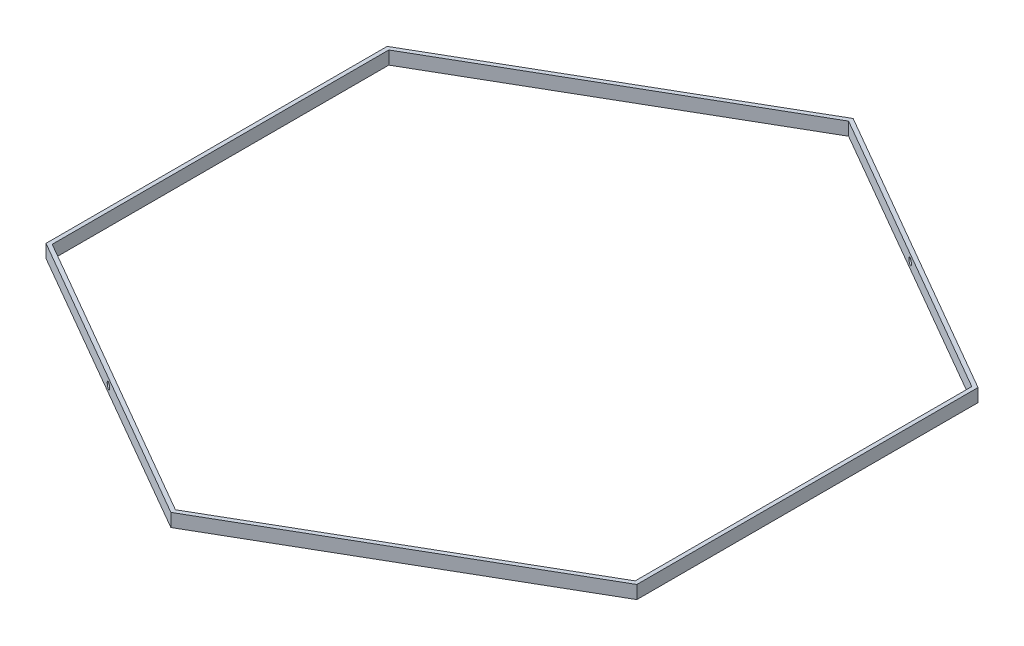
ISO-10303-21;
HEADER;
FILE_DESCRIPTION(('STEP AP214'),'2;1');
FILE_NAME('part.step','',(''),(''),'','','');
FILE_SCHEMA(('AUTOMOTIVE_DESIGN { 1 0 10303 214 1 1 1 1 }'));
ENDSEC;
DATA;
#1=APPLICATION_CONTEXT('core data for automotive mechanical design processes');
#2=APPLICATION_PROTOCOL_DEFINITION('international standard','automotive_design',2000,#1);
#3=PRODUCT_CONTEXT('',#1,'mechanical');
#4=PRODUCT('Part','Part','',(#3));
#5=PRODUCT_RELATED_PRODUCT_CATEGORY('part','',(#4));
#6=PRODUCT_DEFINITION_FORMATION('','',#4);
#7=PRODUCT_DEFINITION_CONTEXT('part definition',#1,'design');
#8=PRODUCT_DEFINITION('design','',#6,#7);
#9=PRODUCT_DEFINITION_SHAPE('','',#8);
#10=(LENGTH_UNIT() NAMED_UNIT(*) SI_UNIT(.MILLI.,.METRE.));
#11=(NAMED_UNIT(*) PLANE_ANGLE_UNIT() SI_UNIT($,.RADIAN.));
#12=(NAMED_UNIT(*) SI_UNIT($,.STERADIAN.) SOLID_ANGLE_UNIT());
#13=UNCERTAINTY_MEASURE_WITH_UNIT(LENGTH_MEASURE(1.E-05),#10,'distance_accuracy_value','');
#14=(GEOMETRIC_REPRESENTATION_CONTEXT(3) GLOBAL_UNCERTAINTY_ASSIGNED_CONTEXT((#13)) GLOBAL_UNIT_ASSIGNED_CONTEXT((#10,
#11,#12)) REPRESENTATION_CONTEXT('',''));
#15=CARTESIAN_POINT('',(0.,0.,0.));
#16=DIRECTION('',(0.,0.,1.));
#17=DIRECTION('',(1.,0.,0.));
#18=AXIS2_PLACEMENT_3D('',#15,#16,#17);
#19=CARTESIAN_POINT('',(0.,4.,0.));
#20=DIRECTION('',(0.,1.,0.));
#21=DIRECTION('',(0.,0.,1.));
#22=AXIS2_PLACEMENT_3D('',#19,#20,#21);
#23=PLANE('',#22);
#24=DIRECTION('',(-0.866025403784439,0.,-0.5));
#25=VECTOR('',#24,1.);
#26=CARTESIAN_POINT('',(90.,4.,-51.9615242270663));
#27=LINE('',#26,#25);
#28=CARTESIAN_POINT('',(90.,4.,-51.9615242270663));
#29=VERTEX_POINT('',#28);
#30=CARTESIAN_POINT('',(0.,4.,-103.923048454133));
#31=VERTEX_POINT('',#30);
#32=EDGE_CURVE('E180',#29,#31,#27,.T.);
#33=ORIENTED_EDGE('',*,*,#32,.T.);
#34=DIRECTION('',(-0.866025403784438,0.,0.5));
#35=VECTOR('',#34,1.);
#36=CARTESIAN_POINT('',(0.,4.,-103.923048454133));
#37=LINE('',#36,#35);
#38=CARTESIAN_POINT('',(-90.,4.,-51.9615242270663));
#39=VERTEX_POINT('',#38);
#40=EDGE_CURVE('E183',#31,#39,#37,.T.);
#41=ORIENTED_EDGE('',*,*,#40,.T.);
#42=DIRECTION('',(0.,0.,1.));
#43=VECTOR('',#42,1.);
#44=CARTESIAN_POINT('',(-90.,4.,-51.9615242270663));
#45=LINE('',#44,#43);
#46=CARTESIAN_POINT('',(-90.,4.,51.9615242270663));
#47=VERTEX_POINT('',#46);
#48=EDGE_CURVE('E186',#39,#47,#45,.T.);
#49=ORIENTED_EDGE('',*,*,#48,.T.);
#50=DIRECTION('',(0.866025403784439,0.,0.5));
#51=VECTOR('',#50,1.);
#52=CARTESIAN_POINT('',(-90.,4.,51.9615242270663));
#53=LINE('',#52,#51);
#54=CARTESIAN_POINT('',(0.,4.,103.923048454133));
#55=VERTEX_POINT('',#54);
#56=EDGE_CURVE('E188',#47,#55,#53,.T.);
#57=ORIENTED_EDGE('',*,*,#56,.T.);
#58=DIRECTION('',(0.866025403784438,0.,-0.5));
#59=VECTOR('',#58,1.);
#60=CARTESIAN_POINT('',(0.,4.,103.923048454133));
#61=LINE('',#60,#59);
#62=CARTESIAN_POINT('',(90.,4.,51.9615242270663));
#63=VERTEX_POINT('',#62);
#64=EDGE_CURVE('E190',#55,#63,#61,.T.);
#65=ORIENTED_EDGE('',*,*,#64,.T.);
#66=DIRECTION('',(0.,0.,-1.));
#67=VECTOR('',#66,1.);
#68=CARTESIAN_POINT('',(90.,4.,51.9615242270663));
#69=LINE('',#68,#67);
#70=EDGE_CURVE('E192',#63,#29,#69,.T.);
#71=ORIENTED_EDGE('',*,*,#70,.T.);
#72=EDGE_LOOP('',(#33,#41,#49,#57,#65,#71));
#73=FACE_BOUND('',#72,.T.);
#74=DIRECTION('',(-0.866025403784439,0.,-0.5));
#75=VECTOR('',#74,1.);
#76=CARTESIAN_POINT('',(88.8,4.,-51.2687039040388));
#77=LINE('',#76,#75);
#78=CARTESIAN_POINT('',(88.8,4.,-51.2687039040388));
#79=VERTEX_POINT('',#78);
#80=CARTESIAN_POINT('',(0.,4.,-102.537407808078));
#81=VERTEX_POINT('',#80);
#82=EDGE_CURVE('E135',#79,#81,#77,.T.);
#83=ORIENTED_EDGE('',*,*,#82,.F.);
#84=DIRECTION('',(0.,0.,-1.));
#85=VECTOR('',#84,1.);
#86=CARTESIAN_POINT('',(88.8,4.,51.2687039040388));
#87=LINE('',#86,#85);
#88=CARTESIAN_POINT('',(88.8,4.,51.2687039040388));
#89=VERTEX_POINT('',#88);
#90=EDGE_CURVE('E127',#89,#79,#87,.T.);
#91=ORIENTED_EDGE('',*,*,#90,.F.);
#92=DIRECTION('',(0.866025403784438,0.,-0.5));
#93=VECTOR('',#92,1.);
#94=CARTESIAN_POINT('',(0.,4.,102.537407808078));
#95=LINE('',#94,#93);
#96=CARTESIAN_POINT('',(0.,4.,102.537407808078));
#97=VERTEX_POINT('',#96);
#98=EDGE_CURVE('E157',#97,#89,#95,.T.);
#99=ORIENTED_EDGE('',*,*,#98,.F.);
#100=DIRECTION('',(0.866025403784439,0.,0.5));
#101=VECTOR('',#100,1.);
#102=CARTESIAN_POINT('',(-88.8,4.,51.2687039040388));
#103=LINE('',#102,#101);
#104=CARTESIAN_POINT('',(-88.8,4.,51.2687039040388));
#105=VERTEX_POINT('',#104);
#106=EDGE_CURVE('E155',#105,#97,#103,.T.);
#107=ORIENTED_EDGE('',*,*,#106,.F.);
#108=DIRECTION('',(0.,0.,1.));
#109=VECTOR('',#108,1.);
#110=CARTESIAN_POINT('',(-88.8,4.,-51.2687039040388));
#111=LINE('',#110,#109);
#112=CARTESIAN_POINT('',(-88.8,4.,-51.2687039040388));
#113=VERTEX_POINT('',#112);
#114=EDGE_CURVE('E150',#113,#105,#111,.T.);
#115=ORIENTED_EDGE('',*,*,#114,.F.);
#116=DIRECTION('',(-0.866025403784439,0.,0.5));
#117=VECTOR('',#116,1.);
#118=CARTESIAN_POINT('',(0.,4.,-102.537407808078));
#119=LINE('',#118,#117);
#120=EDGE_CURVE('E148',#81,#113,#119,.T.);
#121=ORIENTED_EDGE('',*,*,#120,.F.);
#122=EDGE_LOOP('',(#83,#91,#99,#107,#115,#121));
#123=FACE_BOUND('',#122,.T.);
#124=ADVANCED_FACE('F37',(#73,#123),#23,.T.);
#125=CARTESIAN_POINT('',(0.,0.,0.));
#126=DIRECTION('',(0.,1.,0.));
#127=DIRECTION('',(0.,0.,1.));
#128=AXIS2_PLACEMENT_3D('',#125,#126,#127);
#129=PLANE('',#128);
#130=DIRECTION('',(-0.866025403784439,0.,-0.5));
#131=VECTOR('',#130,1.);
#132=CARTESIAN_POINT('',(90.,0.,-51.9615242270663));
#133=LINE('',#132,#131);
#134=CARTESIAN_POINT('',(90.,0.,-51.9615242270663));
#135=VERTEX_POINT('',#134);
#136=CARTESIAN_POINT('',(0.,0.,-103.923048454133));
#137=VERTEX_POINT('',#136);
#138=EDGE_CURVE('E143',#135,#137,#133,.T.);
#139=ORIENTED_EDGE('',*,*,#138,.F.);
#140=DIRECTION('',(0.,0.,-1.));
#141=VECTOR('',#140,1.);
#142=CARTESIAN_POINT('',(90.,0.,51.9615242270663));
#143=LINE('',#142,#141);
#144=CARTESIAN_POINT('',(90.,0.,51.9615242270663));
#145=VERTEX_POINT('',#144);
#146=EDGE_CURVE('E184',#145,#135,#143,.T.);
#147=ORIENTED_EDGE('',*,*,#146,.F.);
#148=DIRECTION('',(0.866025403784438,0.,-0.5));
#149=VECTOR('',#148,1.);
#150=CARTESIAN_POINT('',(0.,0.,103.923048454133));
#151=LINE('',#150,#149);
#152=CARTESIAN_POINT('',(0.,0.,103.923048454133));
#153=VERTEX_POINT('',#152);
#154=EDGE_CURVE('E203',#153,#145,#151,.T.);
#155=ORIENTED_EDGE('',*,*,#154,.F.);
#156=DIRECTION('',(0.866025403784439,0.,0.5));
#157=VECTOR('',#156,1.);
#158=CARTESIAN_POINT('',(-90.,0.,51.9615242270663));
#159=LINE('',#158,#157);
#160=CARTESIAN_POINT('',(-90.,0.,51.9615242270663));
#161=VERTEX_POINT('',#160);
#162=EDGE_CURVE('E201',#161,#153,#159,.T.);
#163=ORIENTED_EDGE('',*,*,#162,.F.);
#164=DIRECTION('',(0.,0.,1.));
#165=VECTOR('',#164,1.);
#166=CARTESIAN_POINT('',(-90.,0.,-51.9615242270663));
#167=LINE('',#166,#165);
#168=CARTESIAN_POINT('',(-90.,0.,-51.9615242270663));
#169=VERTEX_POINT('',#168);
#170=EDGE_CURVE('E199',#169,#161,#167,.T.);
#171=ORIENTED_EDGE('',*,*,#170,.F.);
#172=DIRECTION('',(-0.866025403784438,0.,0.5));
#173=VECTOR('',#172,1.);
#174=CARTESIAN_POINT('',(0.,0.,-103.923048454133));
#175=LINE('',#174,#173);
#176=EDGE_CURVE('E197',#137,#169,#175,.T.);
#177=ORIENTED_EDGE('',*,*,#176,.F.);
#178=EDGE_LOOP('',(#139,#147,#155,#163,#171,#177));
#179=FACE_BOUND('',#178,.T.);
#180=DIRECTION('',(0.,0.,-1.));
#181=VECTOR('',#180,1.);
#182=CARTESIAN_POINT('',(88.8,0.,51.2687039040388));
#183=LINE('',#182,#181);
#184=CARTESIAN_POINT('',(88.8,0.,51.2687039040388));
#185=VERTEX_POINT('',#184);
#186=CARTESIAN_POINT('',(88.8,0.,-51.2687039040388));
#187=VERTEX_POINT('',#186);
#188=EDGE_CURVE('E61',#185,#187,#183,.T.);
#189=ORIENTED_EDGE('',*,*,#188,.T.);
#190=DIRECTION('',(-0.866025403784439,0.,-0.5));
#191=VECTOR('',#190,1.);
#192=CARTESIAN_POINT('',(88.8,0.,-51.2687039040388));
#193=LINE('',#192,#191);
#194=CARTESIAN_POINT('',(0.,0.,-102.537407808078));
#195=VERTEX_POINT('',#194);
#196=EDGE_CURVE('E142',#187,#195,#193,.T.);
#197=ORIENTED_EDGE('',*,*,#196,.T.);
#198=DIRECTION('',(-0.866025403784439,0.,0.5));
#199=VECTOR('',#198,1.);
#200=CARTESIAN_POINT('',(0.,0.,-102.537407808078));
#201=LINE('',#200,#199);
#202=CARTESIAN_POINT('',(-88.8,0.,-51.2687039040388));
#203=VERTEX_POINT('',#202);
#204=EDGE_CURVE('E162',#195,#203,#201,.T.);
#205=ORIENTED_EDGE('',*,*,#204,.T.);
#206=DIRECTION('',(0.,0.,1.));
#207=VECTOR('',#206,1.);
#208=CARTESIAN_POINT('',(-88.8,0.,-51.2687039040388));
#209=LINE('',#208,#207);
#210=CARTESIAN_POINT('',(-88.8,0.,51.2687039040388));
#211=VERTEX_POINT('',#210);
#212=EDGE_CURVE('E165',#203,#211,#209,.T.);
#213=ORIENTED_EDGE('',*,*,#212,.T.);
#214=DIRECTION('',(0.866025403784439,0.,0.5));
#215=VECTOR('',#214,1.);
#216=CARTESIAN_POINT('',(-88.8,0.,51.2687039040388));
#217=LINE('',#216,#215);
#218=CARTESIAN_POINT('',(0.,0.,102.537407808078));
#219=VERTEX_POINT('',#218);
#220=EDGE_CURVE('E168',#211,#219,#217,.T.);
#221=ORIENTED_EDGE('',*,*,#220,.T.);
#222=DIRECTION('',(0.866025403784438,0.,-0.5));
#223=VECTOR('',#222,1.);
#224=CARTESIAN_POINT('',(0.,0.,102.537407808078));
#225=LINE('',#224,#223);
#226=EDGE_CURVE('E136',#219,#185,#225,.T.);
#227=ORIENTED_EDGE('',*,*,#226,.T.);
#228=EDGE_LOOP('',(#189,#197,#205,#213,#221,#227));
#229=FACE_BOUND('',#228,.T.);
#230=ADVANCED_FACE('F228',(#179,#229),#129,.F.);
#231=CARTESIAN_POINT('',(90.,4.,-51.9615242270663));
#232=DIRECTION('',(-0.5,0.,0.866025403784438));
#233=DIRECTION('',(0.866025403784439,0.,0.5));
#234=AXIS2_PLACEMENT_3D('',#231,#232,#233);
#235=PLANE('',#234);
#236=CARTESIAN_POINT('',(45.,2.,-77.9422863405995));
#237=DIRECTION('',(-0.5,0.,0.866025403784438));
#238=DIRECTION('',(0.866025403784439,0.,0.5));
#239=AXIS2_PLACEMENT_3D('',#236,#237,#238);
#240=CIRCLE('',#239,0.999999999999999);
#241=CARTESIAN_POINT('',(45.8660254037845,2.,-77.4422863405995));
#242=VERTEX_POINT('',#241);
#243=EDGE_CURVE('E160',#242,#242,#240,.T.);
#244=ORIENTED_EDGE('',*,*,#243,.T.);
#245=EDGE_LOOP('',(#244));
#246=FACE_BOUND('',#245,.T.);
#247=ORIENTED_EDGE('',*,*,#138,.T.);
#248=DIRECTION('',(0.,-1.,0.));
#249=VECTOR('',#248,1.);
#250=CARTESIAN_POINT('',(0.,4.,-103.923048454133));
#251=LINE('',#250,#249);
#252=EDGE_CURVE('E11',#31,#137,#251,.T.);
#253=ORIENTED_EDGE('',*,*,#252,.F.);
#254=ORIENTED_EDGE('',*,*,#32,.F.);
#255=DIRECTION('',(0.,-1.,0.));
#256=VECTOR('',#255,1.);
#257=CARTESIAN_POINT('',(90.,4.,-51.9615242270663));
#258=LINE('',#257,#256);
#259=EDGE_CURVE('E194',#29,#135,#258,.T.);
#260=ORIENTED_EDGE('',*,*,#259,.T.);
#261=EDGE_LOOP('',(#247,#253,#254,#260));
#262=FACE_BOUND('',#261,.T.);
#263=ADVANCED_FACE('F39',(#246,#262),#235,.F.);
#264=CARTESIAN_POINT('',(0.,4.,-103.923048454133));
#265=DIRECTION('',(0.5,0.,0.866025403784438));
#266=DIRECTION('',(0.866025403784439,0.,-0.5));
#267=AXIS2_PLACEMENT_3D('',#264,#265,#266);
#268=PLANE('',#267);
#269=ORIENTED_EDGE('',*,*,#176,.T.);
#270=DIRECTION('',(0.,-1.,0.));
#271=VECTOR('',#270,1.);
#272=CARTESIAN_POINT('',(-90.,4.,-51.9615242270663));
#273=LINE('',#272,#271);
#274=EDGE_CURVE('E46',#39,#169,#273,.T.);
#275=ORIENTED_EDGE('',*,*,#274,.F.);
#276=ORIENTED_EDGE('',*,*,#40,.F.);
#277=ORIENTED_EDGE('',*,*,#252,.T.);
#278=EDGE_LOOP('',(#269,#275,#276,#277));
#279=FACE_BOUND('',#278,.T.);
#280=ADVANCED_FACE('F245',(#279),#268,.F.);
#281=CARTESIAN_POINT('',(-90.,4.,-51.9615242270663));
#282=DIRECTION('',(1.,0.,0.));
#283=DIRECTION('',(0.,0.,-1.));
#284=AXIS2_PLACEMENT_3D('',#281,#282,#283);
#285=PLANE('',#284);
#286=ORIENTED_EDGE('',*,*,#170,.T.);
#287=DIRECTION('',(0.,-1.,0.));
#288=VECTOR('',#287,1.);
#289=CARTESIAN_POINT('',(-90.,4.,51.9615242270663));
#290=LINE('',#289,#288);
#291=EDGE_CURVE('E214',#47,#161,#290,.T.);
#292=ORIENTED_EDGE('',*,*,#291,.F.);
#293=ORIENTED_EDGE('',*,*,#48,.F.);
#294=ORIENTED_EDGE('',*,*,#274,.T.);
#295=EDGE_LOOP('',(#286,#292,#293,#294));
#296=FACE_BOUND('',#295,.T.);
#297=ADVANCED_FACE('F222',(#296),#285,.F.);
#298=CARTESIAN_POINT('',(-90.,4.,51.9615242270663));
#299=DIRECTION('',(0.5,0.,-0.866025403784439));
#300=DIRECTION('',(-0.866025403784439,0.,-0.5));
#301=AXIS2_PLACEMENT_3D('',#298,#299,#300);
#302=PLANE('',#301);
#303=CARTESIAN_POINT('',(-45.,2.,77.9422863405996));
#304=DIRECTION('',(-0.5,0.,0.866025403784439));
#305=DIRECTION('',(0.866025403784439,0.,0.5));
#306=AXIS2_PLACEMENT_3D('',#303,#304,#305);
#307=CIRCLE('',#306,0.999999999999999);
#308=CARTESIAN_POINT('',(-44.1339745962156,2.,78.4422863405996));
#309=VERTEX_POINT('',#308);
#310=EDGE_CURVE('E295',#309,#309,#307,.T.);
#311=ORIENTED_EDGE('',*,*,#310,.F.);
#312=EDGE_LOOP('',(#311));
#313=FACE_BOUND('',#312,.T.);
#314=ORIENTED_EDGE('',*,*,#162,.T.);
#315=DIRECTION('',(0.,-1.,0.));
#316=VECTOR('',#315,1.);
#317=CARTESIAN_POINT('',(0.,4.,103.923048454133));
#318=LINE('',#317,#316);
#319=EDGE_CURVE('E211',#55,#153,#318,.T.);
#320=ORIENTED_EDGE('',*,*,#319,.F.);
#321=ORIENTED_EDGE('',*,*,#56,.F.);
#322=ORIENTED_EDGE('',*,*,#291,.T.);
#323=EDGE_LOOP('',(#314,#320,#321,#322));
#324=FACE_BOUND('',#323,.T.);
#325=ADVANCED_FACE('F234',(#313,#324),#302,.F.);
#326=CARTESIAN_POINT('',(0.,4.,103.923048454133));
#327=DIRECTION('',(-0.5,0.,-0.866025403784438));
#328=DIRECTION('',(-0.866025403784439,0.,0.5));
#329=AXIS2_PLACEMENT_3D('',#326,#327,#328);
#330=PLANE('',#329);
#331=ORIENTED_EDGE('',*,*,#154,.T.);
#332=DIRECTION('',(0.,-1.,0.));
#333=VECTOR('',#332,1.);
#334=CARTESIAN_POINT('',(90.,4.,51.9615242270663));
#335=LINE('',#334,#333);
#336=EDGE_CURVE('E208',#63,#145,#335,.T.);
#337=ORIENTED_EDGE('',*,*,#336,.F.);
#338=ORIENTED_EDGE('',*,*,#64,.F.);
#339=ORIENTED_EDGE('',*,*,#319,.T.);
#340=EDGE_LOOP('',(#331,#337,#338,#339));
#341=FACE_BOUND('',#340,.T.);
#342=ADVANCED_FACE('F238',(#341),#330,.F.);
#343=CARTESIAN_POINT('',(90.,4.,51.9615242270663));
#344=DIRECTION('',(-1.,0.,0.));
#345=DIRECTION('',(0.,0.,1.));
#346=AXIS2_PLACEMENT_3D('',#343,#344,#345);
#347=PLANE('',#346);
#348=ORIENTED_EDGE('',*,*,#146,.T.);
#349=ORIENTED_EDGE('',*,*,#259,.F.);
#350=ORIENTED_EDGE('',*,*,#70,.F.);
#351=ORIENTED_EDGE('',*,*,#336,.T.);
#352=EDGE_LOOP('',(#348,#349,#350,#351));
#353=FACE_BOUND('',#352,.T.);
#354=ADVANCED_FACE('F248',(#353),#347,.F.);
#355=CARTESIAN_POINT('',(88.8,4.,51.2687039040388));
#356=DIRECTION('',(-1.,0.,0.));
#357=DIRECTION('',(0.,0.,1.));
#358=AXIS2_PLACEMENT_3D('',#355,#356,#357);
#359=PLANE('',#358);
#360=ORIENTED_EDGE('',*,*,#188,.F.);
#361=DIRECTION('',(0.,-1.,0.));
#362=VECTOR('',#361,1.);
#363=CARTESIAN_POINT('',(88.8,4.,51.2687039040388));
#364=LINE('',#363,#362);
#365=EDGE_CURVE('E131',#89,#185,#364,.T.);
#366=ORIENTED_EDGE('',*,*,#365,.F.);
#367=ORIENTED_EDGE('',*,*,#90,.T.);
#368=DIRECTION('',(0.,-1.,0.));
#369=VECTOR('',#368,1.);
#370=CARTESIAN_POINT('',(88.8,4.,-51.2687039040388));
#371=LINE('',#370,#369);
#372=EDGE_CURVE('E130',#79,#187,#371,.T.);
#373=ORIENTED_EDGE('',*,*,#372,.T.);
#374=EDGE_LOOP('',(#360,#366,#367,#373));
#375=FACE_BOUND('',#374,.T.);
#376=ADVANCED_FACE('F129',(#375),#359,.T.);
#377=CARTESIAN_POINT('',(88.8,4.,-51.2687039040388));
#378=DIRECTION('',(-0.5,0.,0.866025403784439));
#379=DIRECTION('',(0.866025403784439,0.,0.5));
#380=AXIS2_PLACEMENT_3D('',#377,#378,#379);
#381=PLANE('',#380);
#382=CARTESIAN_POINT('',(44.4,2.,-76.9030558560581));
#383=DIRECTION('',(-0.5,0.,0.866025403784439));
#384=DIRECTION('',(0.866025403784439,0.,0.5));
#385=AXIS2_PLACEMENT_3D('',#382,#383,#384);
#386=CIRCLE('',#385,0.999999999999999);
#387=CARTESIAN_POINT('',(45.2660254037845,2.,-76.4030558560581));
#388=VERTEX_POINT('',#387);
#389=EDGE_CURVE('E298',#388,#388,#386,.T.);
#390=ORIENTED_EDGE('',*,*,#389,.F.);
#391=EDGE_LOOP('',(#390));
#392=FACE_BOUND('',#391,.T.);
#393=ORIENTED_EDGE('',*,*,#196,.F.);
#394=ORIENTED_EDGE('',*,*,#372,.F.);
#395=ORIENTED_EDGE('',*,*,#82,.T.);
#396=DIRECTION('',(0.,-1.,0.));
#397=VECTOR('',#396,1.);
#398=CARTESIAN_POINT('',(0.,4.,-102.537407808078));
#399=LINE('',#398,#397);
#400=EDGE_CURVE('E144',#81,#195,#399,.T.);
#401=ORIENTED_EDGE('',*,*,#400,.T.);
#402=EDGE_LOOP('',(#393,#394,#395,#401));
#403=FACE_BOUND('',#402,.T.);
#404=ADVANCED_FACE('F139',(#392,#403),#381,.T.);
#405=CARTESIAN_POINT('',(0.,4.,-102.537407808078));
#406=DIRECTION('',(0.5,0.,0.866025403784439));
#407=DIRECTION('',(0.866025403784439,0.,-0.5));
#408=AXIS2_PLACEMENT_3D('',#405,#406,#407);
#409=PLANE('',#408);
#410=ORIENTED_EDGE('',*,*,#204,.F.);
#411=ORIENTED_EDGE('',*,*,#400,.F.);
#412=ORIENTED_EDGE('',*,*,#120,.T.);
#413=DIRECTION('',(0.,-1.,0.));
#414=VECTOR('',#413,1.);
#415=CARTESIAN_POINT('',(-88.8,4.,-51.2687039040388));
#416=LINE('',#415,#414);
#417=EDGE_CURVE('E177',#113,#203,#416,.T.);
#418=ORIENTED_EDGE('',*,*,#417,.T.);
#419=EDGE_LOOP('',(#410,#411,#412,#418));
#420=FACE_BOUND('',#419,.T.);
#421=ADVANCED_FACE('F266',(#420),#409,.T.);
#422=CARTESIAN_POINT('',(-88.8,4.,-51.2687039040388));
#423=DIRECTION('',(1.,0.,0.));
#424=DIRECTION('',(0.,0.,-1.));
#425=AXIS2_PLACEMENT_3D('',#422,#423,#424);
#426=PLANE('',#425);
#427=ORIENTED_EDGE('',*,*,#212,.F.);
#428=ORIENTED_EDGE('',*,*,#417,.F.);
#429=ORIENTED_EDGE('',*,*,#114,.T.);
#430=DIRECTION('',(0.,-1.,0.));
#431=VECTOR('',#430,1.);
#432=CARTESIAN_POINT('',(-88.8,4.,51.2687039040388));
#433=LINE('',#432,#431);
#434=EDGE_CURVE('E175',#105,#211,#433,.T.);
#435=ORIENTED_EDGE('',*,*,#434,.T.);
#436=EDGE_LOOP('',(#427,#428,#429,#435));
#437=FACE_BOUND('',#436,.T.);
#438=ADVANCED_FACE('F270',(#437),#426,.T.);
#439=CARTESIAN_POINT('',(-88.8,4.,51.2687039040388));
#440=DIRECTION('',(0.5,0.,-0.866025403784439));
#441=DIRECTION('',(-0.866025403784439,0.,-0.5));
#442=AXIS2_PLACEMENT_3D('',#439,#440,#441);
#443=PLANE('',#442);
#444=CARTESIAN_POINT('',(-44.4,2.,76.9030558560582));
#445=DIRECTION('',(0.5,0.,-0.866025403784439));
#446=DIRECTION('',(-0.866025403784439,0.,-0.5));
#447=AXIS2_PLACEMENT_3D('',#444,#445,#446);
#448=CIRCLE('',#447,0.999999999999999);
#449=CARTESIAN_POINT('',(-45.2660254037844,2.,76.4030558560582));
#450=VERTEX_POINT('',#449);
#451=EDGE_CURVE('E41',#450,#450,#448,.T.);
#452=ORIENTED_EDGE('',*,*,#451,.F.);
#453=EDGE_LOOP('',(#452));
#454=FACE_BOUND('',#453,.T.);
#455=ORIENTED_EDGE('',*,*,#220,.F.);
#456=ORIENTED_EDGE('',*,*,#434,.F.);
#457=ORIENTED_EDGE('',*,*,#106,.T.);
#458=DIRECTION('',(0.,-1.,0.));
#459=VECTOR('',#458,1.);
#460=CARTESIAN_POINT('',(0.,4.,102.537407808078));
#461=LINE('',#460,#459);
#462=EDGE_CURVE('E53',#97,#219,#461,.T.);
#463=ORIENTED_EDGE('',*,*,#462,.T.);
#464=EDGE_LOOP('',(#455,#456,#457,#463));
#465=FACE_BOUND('',#464,.T.);
#466=ADVANCED_FACE('F274',(#454,#465),#443,.T.);
#467=CARTESIAN_POINT('',(0.,4.,102.537407808078));
#468=DIRECTION('',(-0.5,0.,-0.866025403784439));
#469=DIRECTION('',(-0.866025403784439,0.,0.5));
#470=AXIS2_PLACEMENT_3D('',#467,#468,#469);
#471=PLANE('',#470);
#472=ORIENTED_EDGE('',*,*,#226,.F.);
#473=ORIENTED_EDGE('',*,*,#462,.F.);
#474=ORIENTED_EDGE('',*,*,#98,.T.);
#475=ORIENTED_EDGE('',*,*,#365,.T.);
#476=EDGE_LOOP('',(#472,#473,#474,#475));
#477=FACE_BOUND('',#476,.T.);
#478=ADVANCED_FACE('F278',(#477),#471,.T.);
#479=CARTESIAN_POINT('',(67.5,2.,-116.913429510899));
#480=DIRECTION('',(-0.5,0.,0.866025403784439));
#481=DIRECTION('',(0.866025403784439,0.,0.5));
#482=AXIS2_PLACEMENT_3D('',#479,#480,#481);
#483=CYLINDRICAL_SURFACE('',#482,0.999999999999999);
#484=ORIENTED_EDGE('',*,*,#451,.T.);
#485=EDGE_LOOP('',(#484));
#486=FACE_BOUND('',#485,.T.);
#487=ORIENTED_EDGE('',*,*,#310,.T.);
#488=EDGE_LOOP('',(#487));
#489=FACE_BOUND('',#488,.T.);
#490=ADVANCED_FACE('F282',(#486,#489),#483,.F.);
#491=ORIENTED_EDGE('',*,*,#389,.T.);
#492=EDGE_LOOP('',(#491));
#493=FACE_BOUND('',#492,.T.);
#494=ORIENTED_EDGE('',*,*,#243,.F.);
#495=EDGE_LOOP('',(#494));
#496=FACE_BOUND('',#495,.T.);
#497=ADVANCED_FACE('F284',(#493,#496),#483,.F.);
#498=CLOSED_SHELL('',(#124,#230,#263,#280,#297,#325,#342,#354,#376,#404,#421,#438,#466,#478,
#490,#497));
#499=MANIFOLD_SOLID_BREP('B2',#498);
#500=ADVANCED_BREP_SHAPE_REPRESENTATION('',(#18,#499),#14);
#501=SHAPE_DEFINITION_REPRESENTATION(#9,#500);
ENDSEC;
END-ISO-10303-21;
